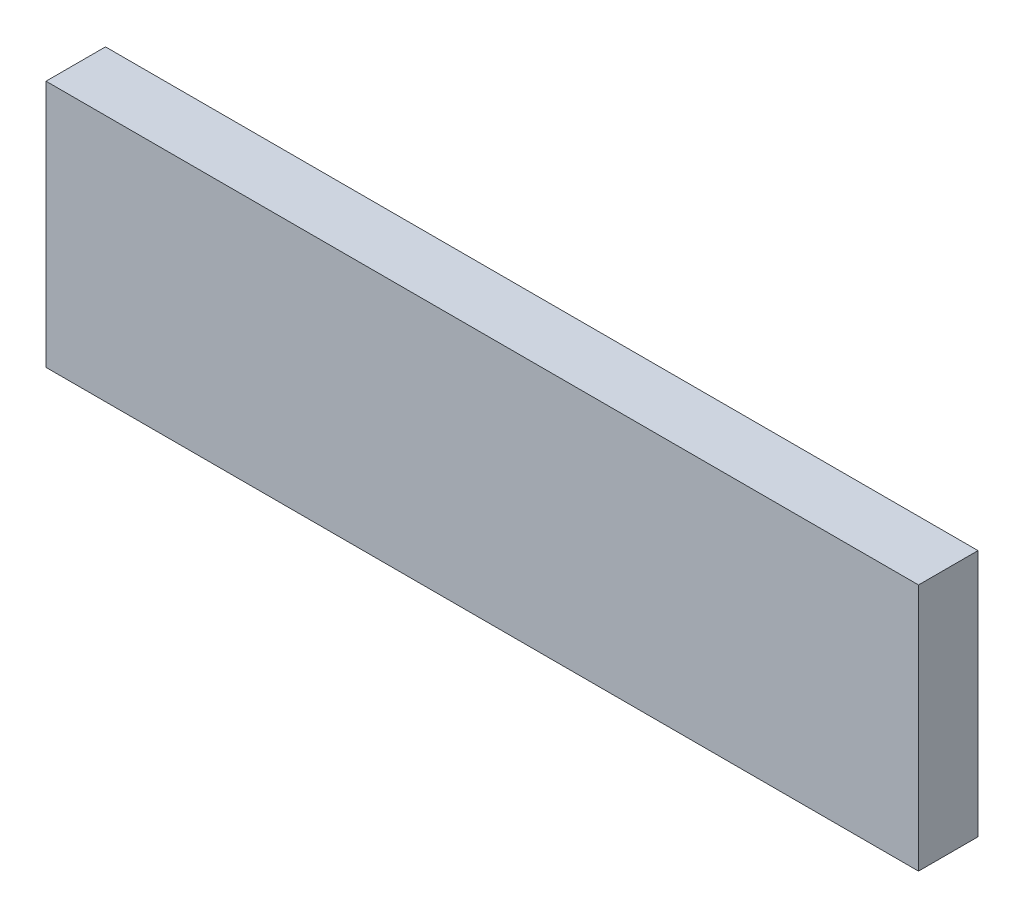
ISO-10303-21;
HEADER;
FILE_DESCRIPTION(('STEP AP214'),'2;1');
FILE_NAME('part.step','',(''),(''),'','','');
FILE_SCHEMA(('AUTOMOTIVE_DESIGN { 1 0 10303 214 1 1 1 1 }'));
ENDSEC;
DATA;
#1=APPLICATION_CONTEXT('core data for automotive mechanical design processes');
#2=APPLICATION_PROTOCOL_DEFINITION('international standard','automotive_design',2000,#1);
#3=PRODUCT_CONTEXT('',#1,'mechanical');
#4=PRODUCT('Part','Part','',(#3));
#5=PRODUCT_RELATED_PRODUCT_CATEGORY('part','',(#4));
#6=PRODUCT_DEFINITION_FORMATION('','',#4);
#7=PRODUCT_DEFINITION_CONTEXT('part definition',#1,'design');
#8=PRODUCT_DEFINITION('design','',#6,#7);
#9=PRODUCT_DEFINITION_SHAPE('','',#8);
#10=(LENGTH_UNIT() NAMED_UNIT(*) SI_UNIT(.MILLI.,.METRE.));
#11=(NAMED_UNIT(*) PLANE_ANGLE_UNIT() SI_UNIT($,.RADIAN.));
#12=(NAMED_UNIT(*) SI_UNIT($,.STERADIAN.) SOLID_ANGLE_UNIT());
#13=UNCERTAINTY_MEASURE_WITH_UNIT(LENGTH_MEASURE(1.E-05),#10,'distance_accuracy_value','');
#14=(GEOMETRIC_REPRESENTATION_CONTEXT(3) GLOBAL_UNCERTAINTY_ASSIGNED_CONTEXT((#13)) GLOBAL_UNIT_ASSIGNED_CONTEXT((#10,
#11,#12)) REPRESENTATION_CONTEXT('',''));
#15=CARTESIAN_POINT('',(0.,0.,0.));
#16=DIRECTION('',(0.,0.,1.));
#17=DIRECTION('',(1.,0.,0.));
#18=AXIS2_PLACEMENT_3D('',#15,#16,#17);
#19=CARTESIAN_POINT('',(44.,-12.5,3.));
#20=DIRECTION('',(-1.,0.,0.));
#21=DIRECTION('',(0.,0.,1.));
#22=AXIS2_PLACEMENT_3D('',#19,#20,#21);
#23=PLANE('',#22);
#24=DIRECTION('',(0.,1.,0.));
#25=VECTOR('',#24,1.);
#26=CARTESIAN_POINT('',(44.,-12.5,-3.));
#27=LINE('',#26,#25);
#28=CARTESIAN_POINT('',(44.,-12.5,-3.));
#29=VERTEX_POINT('',#28);
#30=CARTESIAN_POINT('',(44.,12.5,-3.));
#31=VERTEX_POINT('',#30);
#32=EDGE_CURVE('E96',#29,#31,#27,.T.);
#33=ORIENTED_EDGE('',*,*,#32,.T.);
#34=DIRECTION('',(0.,0.,-1.));
#35=VECTOR('',#34,1.);
#36=CARTESIAN_POINT('',(44.,12.5,3.));
#37=LINE('',#36,#35);
#38=CARTESIAN_POINT('',(44.,12.5,3.));
#39=VERTEX_POINT('',#38);
#40=EDGE_CURVE('E11',#39,#31,#37,.T.);
#41=ORIENTED_EDGE('',*,*,#40,.F.);
#42=DIRECTION('',(0.,1.,0.));
#43=VECTOR('',#42,1.);
#44=CARTESIAN_POINT('',(44.,-12.5,3.));
#45=LINE('',#44,#43);
#46=CARTESIAN_POINT('',(44.,-12.5,3.));
#47=VERTEX_POINT('',#46);
#48=EDGE_CURVE('E84',#47,#39,#45,.T.);
#49=ORIENTED_EDGE('',*,*,#48,.F.);
#50=DIRECTION('',(0.,0.,-1.));
#51=VECTOR('',#50,1.);
#52=CARTESIAN_POINT('',(44.,-12.5,3.));
#53=LINE('',#52,#51);
#54=EDGE_CURVE('E92',#47,#29,#53,.T.);
#55=ORIENTED_EDGE('',*,*,#54,.T.);
#56=EDGE_LOOP('',(#33,#41,#49,#55));
#57=FACE_BOUND('',#56,.T.);
#58=ADVANCED_FACE('F33',(#57),#23,.F.);
#59=CARTESIAN_POINT('',(-44.,12.5,3.));
#60=DIRECTION('',(0.,-1.,0.));
#61=DIRECTION('',(0.,0.,-1.));
#62=AXIS2_PLACEMENT_3D('',#59,#60,#61);
#63=PLANE('',#62);
#64=DIRECTION('',(-1.,0.,0.));
#65=VECTOR('',#64,1.);
#66=CARTESIAN_POINT('',(-44.,12.5,-3.));
#67=LINE('',#66,#65);
#68=CARTESIAN_POINT('',(-44.,12.5,-3.));
#69=VERTEX_POINT('',#68);
#70=EDGE_CURVE('E88',#31,#69,#67,.T.);
#71=ORIENTED_EDGE('',*,*,#70,.T.);
#72=DIRECTION('',(0.,0.,-1.));
#73=VECTOR('',#72,1.);
#74=CARTESIAN_POINT('',(-44.,12.5,3.));
#75=LINE('',#74,#73);
#76=CARTESIAN_POINT('',(-44.,12.5,3.));
#77=VERTEX_POINT('',#76);
#78=EDGE_CURVE('E41',#77,#69,#75,.T.);
#79=ORIENTED_EDGE('',*,*,#78,.F.);
#80=DIRECTION('',(-1.,0.,0.));
#81=VECTOR('',#80,1.);
#82=CARTESIAN_POINT('',(-44.,12.5,3.));
#83=LINE('',#82,#81);
#84=EDGE_CURVE('E79',#39,#77,#83,.T.);
#85=ORIENTED_EDGE('',*,*,#84,.F.);
#86=ORIENTED_EDGE('',*,*,#40,.T.);
#87=EDGE_LOOP('',(#71,#79,#85,#86));
#88=FACE_BOUND('',#87,.T.);
#89=ADVANCED_FACE('F87',(#88),#63,.F.);
#90=CARTESIAN_POINT('',(-44.,-12.5,3.));
#91=DIRECTION('',(1.,0.,0.));
#92=DIRECTION('',(0.,0.,-1.));
#93=AXIS2_PLACEMENT_3D('',#90,#91,#92);
#94=PLANE('',#93);
#95=DIRECTION('',(0.,-1.,0.));
#96=VECTOR('',#95,1.);
#97=CARTESIAN_POINT('',(-44.,-12.5,-3.));
#98=LINE('',#97,#96);
#99=CARTESIAN_POINT('',(-44.,-12.5,-3.));
#100=VERTEX_POINT('',#99);
#101=EDGE_CURVE('E66',#69,#100,#98,.T.);
#102=ORIENTED_EDGE('',*,*,#101,.T.);
#103=DIRECTION('',(0.,0.,-1.));
#104=VECTOR('',#103,1.);
#105=CARTESIAN_POINT('',(-44.,-12.5,3.));
#106=LINE('',#105,#104);
#107=CARTESIAN_POINT('',(-44.,-12.5,3.));
#108=VERTEX_POINT('',#107);
#109=EDGE_CURVE('E89',#108,#100,#106,.T.);
#110=ORIENTED_EDGE('',*,*,#109,.F.);
#111=DIRECTION('',(0.,-1.,0.));
#112=VECTOR('',#111,1.);
#113=CARTESIAN_POINT('',(-44.,-12.5,3.));
#114=LINE('',#113,#112);
#115=EDGE_CURVE('E82',#77,#108,#114,.T.);
#116=ORIENTED_EDGE('',*,*,#115,.F.);
#117=ORIENTED_EDGE('',*,*,#78,.T.);
#118=EDGE_LOOP('',(#102,#110,#116,#117));
#119=FACE_BOUND('',#118,.T.);
#120=ADVANCED_FACE('F90',(#119),#94,.F.);
#121=CARTESIAN_POINT('',(-44.,-12.5,3.));
#122=DIRECTION('',(0.,1.,0.));
#123=DIRECTION('',(0.,0.,1.));
#124=AXIS2_PLACEMENT_3D('',#121,#122,#123);
#125=PLANE('',#124);
#126=DIRECTION('',(1.,0.,0.));
#127=VECTOR('',#126,1.);
#128=CARTESIAN_POINT('',(-44.,-12.5,-3.));
#129=LINE('',#128,#127);
#130=EDGE_CURVE('E72',#100,#29,#129,.T.);
#131=ORIENTED_EDGE('',*,*,#130,.T.);
#132=ORIENTED_EDGE('',*,*,#54,.F.);
#133=DIRECTION('',(1.,0.,0.));
#134=VECTOR('',#133,1.);
#135=CARTESIAN_POINT('',(-44.,-12.5,3.));
#136=LINE('',#135,#134);
#137=EDGE_CURVE('E49',#108,#47,#136,.T.);
#138=ORIENTED_EDGE('',*,*,#137,.F.);
#139=ORIENTED_EDGE('',*,*,#109,.T.);
#140=EDGE_LOOP('',(#131,#132,#138,#139));
#141=FACE_BOUND('',#140,.T.);
#142=ADVANCED_FACE('F103',(#141),#125,.F.);
#143=CARTESIAN_POINT('',(0.,0.,3.));
#144=DIRECTION('',(0.,0.,-1.));
#145=DIRECTION('',(-1.,0.,0.));
#146=AXIS2_PLACEMENT_3D('',#143,#144,#145);
#147=PLANE('',#146);
#148=ORIENTED_EDGE('',*,*,#48,.T.);
#149=ORIENTED_EDGE('',*,*,#84,.T.);
#150=ORIENTED_EDGE('',*,*,#115,.T.);
#151=ORIENTED_EDGE('',*,*,#137,.T.);
#152=EDGE_LOOP('',(#148,#149,#150,#151));
#153=FACE_BOUND('',#152,.T.);
#154=ADVANCED_FACE('F80',(#153),#147,.F.);
#155=CARTESIAN_POINT('',(0.,0.,-3.));
#156=DIRECTION('',(0.,0.,-1.));
#157=DIRECTION('',(-1.,0.,0.));
#158=AXIS2_PLACEMENT_3D('',#155,#156,#157);
#159=PLANE('',#158);
#160=ORIENTED_EDGE('',*,*,#32,.F.);
#161=ORIENTED_EDGE('',*,*,#130,.F.);
#162=ORIENTED_EDGE('',*,*,#101,.F.);
#163=ORIENTED_EDGE('',*,*,#70,.F.);
#164=EDGE_LOOP('',(#160,#161,#162,#163));
#165=FACE_BOUND('',#164,.T.);
#166=ADVANCED_FACE('F106',(#165),#159,.T.);
#167=CLOSED_SHELL('',(#58,#89,#120,#142,#154,#166));
#168=MANIFOLD_SOLID_BREP('B2',#167);
#169=ADVANCED_BREP_SHAPE_REPRESENTATION('',(#18,#168),#14);
#170=SHAPE_DEFINITION_REPRESENTATION(#9,#169);
ENDSEC;
END-ISO-10303-21;
